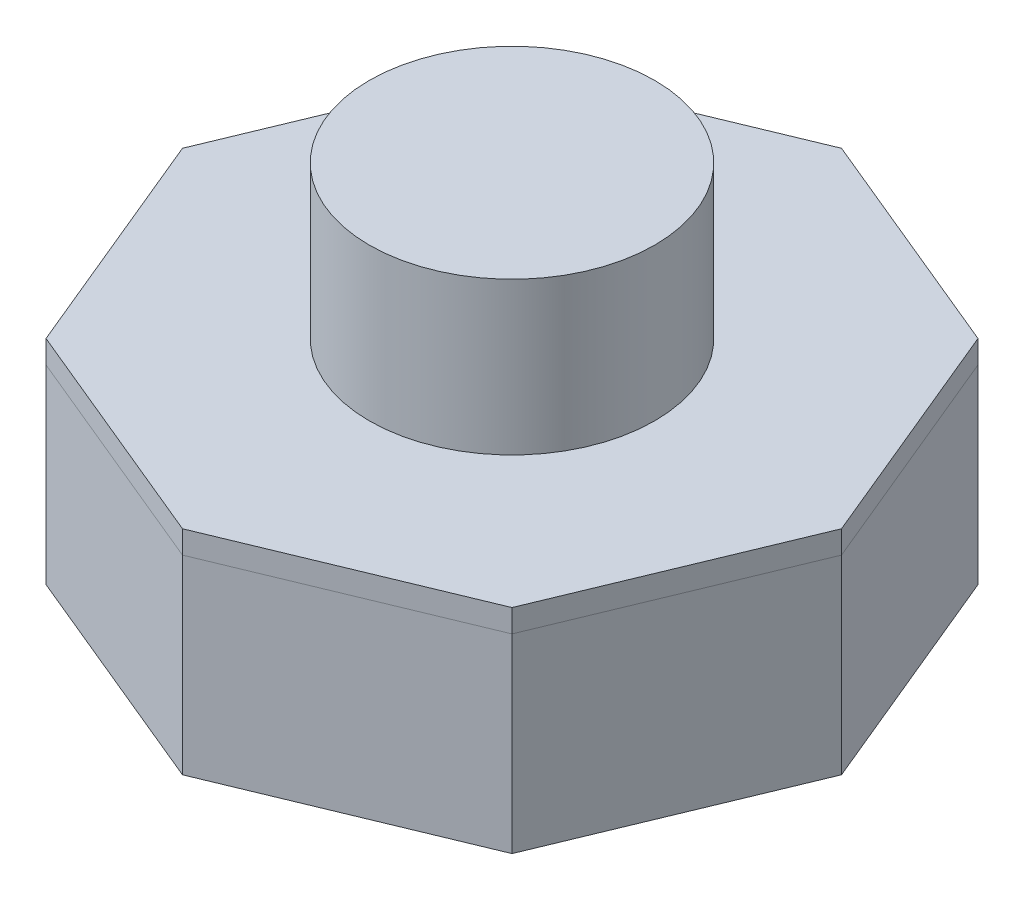
ISO-10303-21;
HEADER;
FILE_DESCRIPTION(('STEP AP214'),'2;1');
FILE_NAME('part.step','',(''),(''),'','','');
FILE_SCHEMA(('AUTOMOTIVE_DESIGN { 1 0 10303 214 1 1 1 1 }'));
ENDSEC;
DATA;
#1=APPLICATION_CONTEXT('core data for automotive mechanical design processes');
#2=APPLICATION_PROTOCOL_DEFINITION('international standard','automotive_design',2000,#1);
#3=PRODUCT_CONTEXT('',#1,'mechanical');
#4=PRODUCT('Part','Part','',(#3));
#5=PRODUCT_RELATED_PRODUCT_CATEGORY('part','',(#4));
#6=PRODUCT_DEFINITION_FORMATION('','',#4);
#7=PRODUCT_DEFINITION_CONTEXT('part definition',#1,'design');
#8=PRODUCT_DEFINITION('design','',#6,#7);
#9=PRODUCT_DEFINITION_SHAPE('','',#8);
#10=(LENGTH_UNIT() NAMED_UNIT(*) SI_UNIT(.MILLI.,.METRE.));
#11=(NAMED_UNIT(*) PLANE_ANGLE_UNIT() SI_UNIT($,.RADIAN.));
#12=(NAMED_UNIT(*) SI_UNIT($,.STERADIAN.) SOLID_ANGLE_UNIT());
#13=UNCERTAINTY_MEASURE_WITH_UNIT(LENGTH_MEASURE(1.E-05),#10,'distance_accuracy_value','');
#14=(GEOMETRIC_REPRESENTATION_CONTEXT(3) GLOBAL_UNCERTAINTY_ASSIGNED_CONTEXT((#13)) GLOBAL_UNIT_ASSIGNED_CONTEXT((#10,
#11,#12)) REPRESENTATION_CONTEXT('',''));
#15=CARTESIAN_POINT('',(0.,0.,0.));
#16=DIRECTION('',(0.,0.,1.));
#17=DIRECTION('',(1.,0.,0.));
#18=AXIS2_PLACEMENT_3D('',#15,#16,#17);
#19=CARTESIAN_POINT('',(17.3182752046783,-10.,-1.25433475933267E-12));
#20=DIRECTION('',(-0.923879532511314,0.,-0.382683432365023));
#21=DIRECTION('',(-0.382683432365023,0.,0.923879532511315));
#22=AXIS2_PLACEMENT_3D('',#19,#20,#21);
#23=PLANE('',#22);
#24=DIRECTION('',(-0.382683432365023,0.,0.923879532511314));
#25=VECTOR('',#24,1.);
#26=CARTESIAN_POINT('',(17.3182752046783,0.,-1.25433475933267E-12));
#27=LINE('',#26,#25);
#28=CARTESIAN_POINT('',(17.3182752046783,0.,-1.25433475933267E-12));
#29=VERTEX_POINT('',#28);
#30=CARTESIAN_POINT('',(12.2458698356837,0.,12.245869835682));
#31=VERTEX_POINT('',#30);
#32=EDGE_CURVE('E139',#29,#31,#27,.T.);
#33=ORIENTED_EDGE('',*,*,#32,.T.);
#34=DIRECTION('',(0.,1.,0.));
#35=VECTOR('',#34,1.);
#36=CARTESIAN_POINT('',(12.2458698356837,-10.,12.245869835682));
#37=LINE('',#36,#35);
#38=CARTESIAN_POINT('',(12.2458698356837,-10.,12.245869835682));
#39=VERTEX_POINT('',#38);
#40=EDGE_CURVE('E12',#39,#31,#37,.T.);
#41=ORIENTED_EDGE('',*,*,#40,.F.);
#42=DIRECTION('',(-0.382683432365023,0.,0.923879532511314));
#43=VECTOR('',#42,1.);
#44=CARTESIAN_POINT('',(17.3182752046783,-10.,-1.25433475933267E-12));
#45=LINE('',#44,#43);
#46=CARTESIAN_POINT('',(17.3182752046783,-10.,-1.25433475933267E-12));
#47=VERTEX_POINT('',#46);
#48=EDGE_CURVE('E153',#47,#39,#45,.T.);
#49=ORIENTED_EDGE('',*,*,#48,.F.);
#50=DIRECTION('',(0.,1.,0.));
#51=VECTOR('',#50,1.);
#52=CARTESIAN_POINT('',(17.3182752046783,-10.,-1.25433475933267E-12));
#53=LINE('',#52,#51);
#54=EDGE_CURVE('E135',#47,#29,#53,.T.);
#55=ORIENTED_EDGE('',*,*,#54,.T.);
#56=EDGE_LOOP('',(#33,#41,#49,#55));
#57=FACE_BOUND('',#56,.T.);
#58=ADVANCED_FACE('F43',(#57),#23,.F.);
#59=CARTESIAN_POINT('',(12.2458698356837,-10.,12.245869835682));
#60=DIRECTION('',(-0.382683432365156,0.,-0.923879532511259));
#61=DIRECTION('',(-0.923879532511259,0.,0.382683432365156));
#62=AXIS2_PLACEMENT_3D('',#59,#60,#61);
#63=PLANE('',#62);
#64=DIRECTION('',(-0.923879532511259,0.,0.382683432365156));
#65=VECTOR('',#64,1.);
#66=CARTESIAN_POINT('',(12.2458698356837,0.,12.245869835682));
#67=LINE('',#66,#65);
#68=CARTESIAN_POINT('',(1.24662596782279E-12,0.,17.3182752046783));
#69=VERTEX_POINT('',#68);
#70=EDGE_CURVE('E142',#31,#69,#67,.T.);
#71=ORIENTED_EDGE('',*,*,#70,.T.);
#72=DIRECTION('',(0.,1.,0.));
#73=VECTOR('',#72,1.);
#74=CARTESIAN_POINT('',(1.24662596782279E-12,-10.,17.3182752046783));
#75=LINE('',#74,#73);
#76=CARTESIAN_POINT('',(1.24662596782279E-12,-10.,17.3182752046783));
#77=VERTEX_POINT('',#76);
#78=EDGE_CURVE('E51',#77,#69,#75,.T.);
#79=ORIENTED_EDGE('',*,*,#78,.F.);
#80=DIRECTION('',(-0.923879532511259,0.,0.382683432365156));
#81=VECTOR('',#80,1.);
#82=CARTESIAN_POINT('',(12.2458698356837,-10.,12.245869835682));
#83=LINE('',#82,#81);
#84=EDGE_CURVE('E102',#39,#77,#83,.T.);
#85=ORIENTED_EDGE('',*,*,#84,.F.);
#86=ORIENTED_EDGE('',*,*,#40,.T.);
#87=EDGE_LOOP('',(#71,#79,#85,#86));
#88=FACE_BOUND('',#87,.T.);
#89=ADVANCED_FACE('F188',(#88),#63,.F.);
#90=CARTESIAN_POINT('',(1.24662596782279E-12,-10.,17.3182752046783));
#91=DIRECTION('',(0.382683432365023,0.,-0.923879532511314));
#92=DIRECTION('',(-0.923879532511314,0.,-0.382683432365023));
#93=AXIS2_PLACEMENT_3D('',#90,#91,#92);
#94=PLANE('',#93);
#95=DIRECTION('',(-0.923879532511314,0.,-0.382683432365023));
#96=VECTOR('',#95,1.);
#97=CARTESIAN_POINT('',(1.24662596782279E-12,0.,17.3182752046783));
#98=LINE('',#97,#96);
#99=CARTESIAN_POINT('',(-12.245869835682,0.,12.2458698356837));
#100=VERTEX_POINT('',#99);
#101=EDGE_CURVE('E144',#69,#100,#98,.T.);
#102=ORIENTED_EDGE('',*,*,#101,.T.);
#103=DIRECTION('',(0.,1.,0.));
#104=VECTOR('',#103,1.);
#105=CARTESIAN_POINT('',(-12.245869835682,-10.,12.2458698356837));
#106=LINE('',#105,#104);
#107=CARTESIAN_POINT('',(-12.245869835682,-10.,12.2458698356837));
#108=VERTEX_POINT('',#107);
#109=EDGE_CURVE('E160',#108,#100,#106,.T.);
#110=ORIENTED_EDGE('',*,*,#109,.F.);
#111=DIRECTION('',(-0.923879532511314,0.,-0.382683432365023));
#112=VECTOR('',#111,1.);
#113=CARTESIAN_POINT('',(1.24662596782279E-12,-10.,17.3182752046783));
#114=LINE('',#113,#112);
#115=EDGE_CURVE('E168',#77,#108,#114,.T.);
#116=ORIENTED_EDGE('',*,*,#115,.F.);
#117=ORIENTED_EDGE('',*,*,#78,.T.);
#118=EDGE_LOOP('',(#102,#110,#116,#117));
#119=FACE_BOUND('',#118,.T.);
#120=ADVANCED_FACE('F166',(#119),#94,.F.);
#121=CARTESIAN_POINT('',(-12.245869835682,-10.,12.2458698356837));
#122=DIRECTION('',(0.923879532511259,0.,-0.382683432365157));
#123=DIRECTION('',(-0.382683432365157,0.,-0.923879532511259));
#124=AXIS2_PLACEMENT_3D('',#121,#122,#123);
#125=PLANE('',#124);
#126=DIRECTION('',(-0.382683432365157,0.,-0.923879532511259));
#127=VECTOR('',#126,1.);
#128=CARTESIAN_POINT('',(-12.245869835682,0.,12.2458698356837));
#129=LINE('',#128,#127);
#130=CARTESIAN_POINT('',(-17.3182752046783,0.,1.25073562617928E-12));
#131=VERTEX_POINT('',#130);
#132=EDGE_CURVE('E146',#100,#131,#129,.T.);
#133=ORIENTED_EDGE('',*,*,#132,.T.);
#134=DIRECTION('',(0.,1.,0.));
#135=VECTOR('',#134,1.);
#136=CARTESIAN_POINT('',(-17.3182752046783,-10.,1.25073562617928E-12));
#137=LINE('',#136,#135);
#138=CARTESIAN_POINT('',(-17.3182752046783,-10.,1.25073562617928E-12));
#139=VERTEX_POINT('',#138);
#140=EDGE_CURVE('E157',#139,#131,#137,.T.);
#141=ORIENTED_EDGE('',*,*,#140,.F.);
#142=DIRECTION('',(-0.382683432365157,0.,-0.923879532511259));
#143=VECTOR('',#142,1.);
#144=CARTESIAN_POINT('',(-12.245869835682,-10.,12.2458698356837));
#145=LINE('',#144,#143);
#146=EDGE_CURVE('E180',#108,#139,#145,.T.);
#147=ORIENTED_EDGE('',*,*,#146,.F.);
#148=ORIENTED_EDGE('',*,*,#109,.T.);
#149=EDGE_LOOP('',(#133,#141,#147,#148));
#150=FACE_BOUND('',#149,.T.);
#151=ADVANCED_FACE('F176',(#150),#125,.F.);
#152=CARTESIAN_POINT('',(-17.3182752046783,-10.,1.25073562617928E-12));
#153=DIRECTION('',(0.923879532511314,0.,0.382683432365023));
#154=DIRECTION('',(0.382683432365023,0.,-0.923879532511314));
#155=AXIS2_PLACEMENT_3D('',#152,#153,#154);
#156=PLANE('',#155);
#157=DIRECTION('',(0.382683432365023,0.,-0.923879532511314));
#158=VECTOR('',#157,1.);
#159=CARTESIAN_POINT('',(-17.3182752046783,0.,1.25073562617928E-12));
#160=LINE('',#159,#158);
#161=CARTESIAN_POINT('',(-12.2458698356837,0.,-12.245869835682));
#162=VERTEX_POINT('',#161);
#163=EDGE_CURVE('E148',#131,#162,#160,.T.);
#164=ORIENTED_EDGE('',*,*,#163,.T.);
#165=DIRECTION('',(0.,1.,0.));
#166=VECTOR('',#165,1.);
#167=CARTESIAN_POINT('',(-12.2458698356837,-10.,-12.245869835682));
#168=LINE('',#167,#166);
#169=CARTESIAN_POINT('',(-12.2458698356837,-10.,-12.245869835682));
#170=VERTEX_POINT('',#169);
#171=EDGE_CURVE('E130',#170,#162,#168,.T.);
#172=ORIENTED_EDGE('',*,*,#171,.F.);
#173=DIRECTION('',(0.382683432365023,0.,-0.923879532511314));
#174=VECTOR('',#173,1.);
#175=CARTESIAN_POINT('',(-17.3182752046783,-10.,1.25073562617928E-12));
#176=LINE('',#175,#174);
#177=EDGE_CURVE('E121',#139,#170,#176,.T.);
#178=ORIENTED_EDGE('',*,*,#177,.F.);
#179=ORIENTED_EDGE('',*,*,#140,.T.);
#180=EDGE_LOOP('',(#164,#172,#178,#179));
#181=FACE_BOUND('',#180,.T.);
#182=ADVANCED_FACE('F179',(#181),#156,.F.);
#183=CARTESIAN_POINT('',(-12.2458698356837,-10.,-12.245869835682));
#184=DIRECTION('',(0.382683432365156,0.,0.923879532511259));
#185=DIRECTION('',(0.923879532511259,0.,-0.382683432365156));
#186=AXIS2_PLACEMENT_3D('',#183,#184,#185);
#187=PLANE('',#186);
#188=DIRECTION('',(0.923879532511259,0.,-0.382683432365157));
#189=VECTOR('',#188,1.);
#190=CARTESIAN_POINT('',(-12.2458698356837,0.,-12.245869835682));
#191=LINE('',#190,#189);
#192=CARTESIAN_POINT('',(-1.25092236488736E-12,0.,-17.3182752046783));
#193=VERTEX_POINT('',#192);
#194=EDGE_CURVE('E129',#162,#193,#191,.T.);
#195=ORIENTED_EDGE('',*,*,#194,.T.);
#196=DIRECTION('',(0.,1.,0.));
#197=VECTOR('',#196,1.);
#198=CARTESIAN_POINT('',(-1.25092236488736E-12,-10.,-17.3182752046783));
#199=LINE('',#198,#197);
#200=CARTESIAN_POINT('',(-1.25092236488736E-12,-10.,-17.3182752046783));
#201=VERTEX_POINT('',#200);
#202=EDGE_CURVE('E126',#201,#193,#199,.T.);
#203=ORIENTED_EDGE('',*,*,#202,.F.);
#204=DIRECTION('',(0.923879532511259,0.,-0.382683432365157));
#205=VECTOR('',#204,1.);
#206=CARTESIAN_POINT('',(-12.2458698356837,-10.,-12.245869835682));
#207=LINE('',#206,#205);
#208=EDGE_CURVE('E115',#170,#201,#207,.T.);
#209=ORIENTED_EDGE('',*,*,#208,.F.);
#210=ORIENTED_EDGE('',*,*,#171,.T.);
#211=EDGE_LOOP('',(#195,#203,#209,#210));
#212=FACE_BOUND('',#211,.T.);
#213=ADVANCED_FACE('F127',(#212),#187,.F.);
#214=CARTESIAN_POINT('',(-1.25092236488736E-12,-10.,-17.3182752046783));
#215=DIRECTION('',(-0.382683432365023,0.,0.923879532511314));
#216=DIRECTION('',(0.923879532511314,0.,0.382683432365023));
#217=AXIS2_PLACEMENT_3D('',#214,#215,#216);
#218=PLANE('',#217);
#219=DIRECTION('',(0.923879532511314,0.,0.382683432365023));
#220=VECTOR('',#219,1.);
#221=CARTESIAN_POINT('',(-1.25092236488736E-12,0.,-17.3182752046783));
#222=LINE('',#221,#220);
#223=CARTESIAN_POINT('',(12.245869835682,0.,-12.2458698356837));
#224=VERTEX_POINT('',#223);
#225=EDGE_CURVE('E88',#193,#224,#222,.T.);
#226=ORIENTED_EDGE('',*,*,#225,.T.);
#227=DIRECTION('',(0.,1.,0.));
#228=VECTOR('',#227,1.);
#229=CARTESIAN_POINT('',(12.245869835682,-10.,-12.2458698356837));
#230=LINE('',#229,#228);
#231=CARTESIAN_POINT('',(12.245869835682,-10.,-12.2458698356837));
#232=VERTEX_POINT('',#231);
#233=EDGE_CURVE('E131',#232,#224,#230,.T.);
#234=ORIENTED_EDGE('',*,*,#233,.F.);
#235=DIRECTION('',(0.923879532511314,0.,0.382683432365023));
#236=VECTOR('',#235,1.);
#237=CARTESIAN_POINT('',(-1.25092236488736E-12,-10.,-17.3182752046783));
#238=LINE('',#237,#236);
#239=EDGE_CURVE('E119',#201,#232,#238,.T.);
#240=ORIENTED_EDGE('',*,*,#239,.F.);
#241=ORIENTED_EDGE('',*,*,#202,.T.);
#242=EDGE_LOOP('',(#226,#234,#240,#241));
#243=FACE_BOUND('',#242,.T.);
#244=ADVANCED_FACE('F133',(#243),#218,.F.);
#245=CARTESIAN_POINT('',(12.245869835682,-10.,-12.2458698356837));
#246=DIRECTION('',(-0.923879532511259,0.,0.382683432365157));
#247=DIRECTION('',(0.382683432365157,0.,0.923879532511259));
#248=AXIS2_PLACEMENT_3D('',#245,#246,#247);
#249=PLANE('',#248);
#250=DIRECTION('',(0.382683432365157,0.,0.923879532511259));
#251=VECTOR('',#250,1.);
#252=CARTESIAN_POINT('',(12.245869835682,0.,-12.2458698356837));
#253=LINE('',#252,#251);
#254=EDGE_CURVE('E94',#224,#29,#253,.T.);
#255=ORIENTED_EDGE('',*,*,#254,.T.);
#256=ORIENTED_EDGE('',*,*,#54,.F.);
#257=DIRECTION('',(0.382683432365157,0.,0.923879532511259));
#258=VECTOR('',#257,1.);
#259=CARTESIAN_POINT('',(12.245869835682,-10.,-12.2458698356837));
#260=LINE('',#259,#258);
#261=EDGE_CURVE('E59',#232,#47,#260,.T.);
#262=ORIENTED_EDGE('',*,*,#261,.F.);
#263=ORIENTED_EDGE('',*,*,#233,.T.);
#264=EDGE_LOOP('',(#255,#256,#262,#263));
#265=FACE_BOUND('',#264,.T.);
#266=ADVANCED_FACE('F204',(#265),#249,.F.);
#267=CARTESIAN_POINT('',(0.,-10.,0.));
#268=DIRECTION('',(0.,-1.,0.));
#269=DIRECTION('',(0.,0.,-1.));
#270=AXIS2_PLACEMENT_3D('',#267,#268,#269);
#271=PLANE('',#270);
#272=ORIENTED_EDGE('',*,*,#48,.T.);
#273=ORIENTED_EDGE('',*,*,#84,.T.);
#274=ORIENTED_EDGE('',*,*,#115,.T.);
#275=ORIENTED_EDGE('',*,*,#146,.T.);
#276=ORIENTED_EDGE('',*,*,#177,.T.);
#277=ORIENTED_EDGE('',*,*,#208,.T.);
#278=ORIENTED_EDGE('',*,*,#239,.T.);
#279=ORIENTED_EDGE('',*,*,#261,.T.);
#280=EDGE_LOOP('',(#272,#273,#274,#275,#276,#277,#278,#279));
#281=FACE_BOUND('',#280,.T.);
#282=ADVANCED_FACE('F117',(#281),#271,.T.);
#283=CARTESIAN_POINT('',(0.,0.,0.));
#284=DIRECTION('',(0.,-1.,0.));
#285=DIRECTION('',(0.,0.,-1.));
#286=AXIS2_PLACEMENT_3D('',#283,#284,#285);
#287=PLANE('',#286);
#288=ORIENTED_EDGE('',*,*,#32,.F.);
#289=ORIENTED_EDGE('',*,*,#254,.F.);
#290=ORIENTED_EDGE('',*,*,#225,.F.);
#291=ORIENTED_EDGE('',*,*,#194,.F.);
#292=ORIENTED_EDGE('',*,*,#163,.F.);
#293=ORIENTED_EDGE('',*,*,#132,.F.);
#294=ORIENTED_EDGE('',*,*,#101,.F.);
#295=ORIENTED_EDGE('',*,*,#70,.F.);
#296=EDGE_LOOP('',(#288,#289,#290,#291,#292,#293,#294,#295));
#297=FACE_BOUND('',#296,.T.);
#298=ADVANCED_FACE('F172',(#297),#287,.F.);
#299=CLOSED_SHELL('',(#58,#89,#120,#151,#182,#213,#244,#266,#282,#298));
#300=MANIFOLD_SOLID_BREP('B2',#299);
#301=CARTESIAN_POINT('',(0.,1.2,0.));
#302=DIRECTION('',(0.,1.,0.));
#303=DIRECTION('',(0.,0.,1.));
#304=AXIS2_PLACEMENT_3D('',#301,#302,#303);
#305=PLANE('',#304);
#306=DIRECTION('',(0.923879532511317,0.,0.382683432365017));
#307=VECTOR('',#306,1.);
#308=CARTESIAN_POINT('',(-12.2458698356819,1.2,12.2458698356838));
#309=LINE('',#308,#307);
#310=CARTESIAN_POINT('',(-12.2458698356819,1.2,12.2458698356838));
#311=VERTEX_POINT('',#310);
#312=CARTESIAN_POINT('',(1.35481903473789E-12,1.2,17.3182752046783));
#313=VERTEX_POINT('',#312);
#314=EDGE_CURVE('E383',#311,#313,#309,.T.);
#315=ORIENTED_EDGE('',*,*,#314,.T.);
#316=DIRECTION('',(0.923879532511257,0.,-0.382683432365162));
#317=VECTOR('',#316,1.);
#318=CARTESIAN_POINT('',(1.35481903473789E-12,1.2,17.3182752046783));
#319=LINE('',#318,#317);
#320=CARTESIAN_POINT('',(12.2458698356838,1.2,12.2458698356819));
#321=VERTEX_POINT('',#320);
#322=EDGE_CURVE('E331',#313,#321,#319,.T.);
#323=ORIENTED_EDGE('',*,*,#322,.T.);
#324=DIRECTION('',(0.382683432365017,0.,-0.923879532511317));
#325=VECTOR('',#324,1.);
#326=CARTESIAN_POINT('',(12.2458698356838,1.2,12.2458698356819));
#327=LINE('',#326,#325);
#328=CARTESIAN_POINT('',(17.3182752046783,1.2,-1.36002320516582E-12));
#329=VERTEX_POINT('',#328);
#330=EDGE_CURVE('E398',#321,#329,#327,.T.);
#331=ORIENTED_EDGE('',*,*,#330,.T.);
#332=DIRECTION('',(-0.382683432365163,0.,-0.923879532511257));
#333=VECTOR('',#332,1.);
#334=CARTESIAN_POINT('',(17.3182752046783,1.2,-1.36002320516582E-12));
#335=LINE('',#334,#333);
#336=CARTESIAN_POINT('',(12.2458698356819,1.2,-12.2458698356838));
#337=VERTEX_POINT('',#336);
#338=EDGE_CURVE('E410',#329,#337,#335,.T.);
#339=ORIENTED_EDGE('',*,*,#338,.T.);
#340=DIRECTION('',(-0.923879532511317,0.,-0.382683432365017));
#341=VECTOR('',#340,1.);
#342=CARTESIAN_POINT('',(12.2458698356819,1.2,-12.2458698356838));
#343=LINE('',#342,#341);
#344=CARTESIAN_POINT('',(-1.36002320516582E-12,1.2,-17.3182752046783));
#345=VERTEX_POINT('',#344);
#346=EDGE_CURVE('E350',#337,#345,#343,.T.);
#347=ORIENTED_EDGE('',*,*,#346,.T.);
#348=DIRECTION('',(-0.923879532511257,0.,0.382683432365163));
#349=VECTOR('',#348,1.);
#350=CARTESIAN_POINT('',(-1.36002320516582E-12,1.2,-17.3182752046783));
#351=LINE('',#350,#349);
#352=CARTESIAN_POINT('',(-12.2458698356838,1.2,-12.2458698356819));
#353=VERTEX_POINT('',#352);
#354=EDGE_CURVE('E344',#345,#353,#351,.T.);
#355=ORIENTED_EDGE('',*,*,#354,.T.);
#356=DIRECTION('',(-0.382683432365017,0.,0.923879532511317));
#357=VECTOR('',#356,1.);
#358=CARTESIAN_POINT('',(-12.2458698356838,1.2,-12.2458698356819));
#359=LINE('',#358,#357);
#360=CARTESIAN_POINT('',(-17.3182752046783,1.2,1.35481903473789E-12));
#361=VERTEX_POINT('',#360);
#362=EDGE_CURVE('E348',#353,#361,#359,.T.);
#363=ORIENTED_EDGE('',*,*,#362,.T.);
#364=DIRECTION('',(0.382683432365162,0.,0.923879532511257));
#365=VECTOR('',#364,1.);
#366=CARTESIAN_POINT('',(-17.3182752046783,1.2,1.35481903473789E-12));
#367=LINE('',#366,#365);
#368=EDGE_CURVE('E288',#361,#311,#367,.T.);
#369=ORIENTED_EDGE('',*,*,#368,.T.);
#370=EDGE_LOOP('',(#315,#323,#331,#339,#347,#355,#363,#369));
#371=FACE_BOUND('',#370,.T.);
#372=CARTESIAN_POINT('',(0.,1.2,0.));
#373=DIRECTION('',(0.,1.,0.));
#374=DIRECTION('',(0.,0.,1.));
#375=AXIS2_PLACEMENT_3D('',#372,#373,#374);
#376=CIRCLE('',#375,7.5);
#377=CARTESIAN_POINT('',(0.,1.2,7.5));
#378=VERTEX_POINT('',#377);
#379=EDGE_CURVE('E416',#378,#378,#376,.T.);
#380=ORIENTED_EDGE('',*,*,#379,.F.);
#381=EDGE_LOOP('',(#380));
#382=FACE_BOUND('',#381,.T.);
#383=ADVANCED_FACE('F271',(#371,#382),#305,.T.);
#384=CARTESIAN_POINT('',(-12.2458698356819,1.2,12.2458698356838));
#385=DIRECTION('',(0.382683432365017,0.,-0.923879532511317));
#386=DIRECTION('',(-0.923879532511317,0.,-0.382683432365017));
#387=AXIS2_PLACEMENT_3D('',#384,#385,#386);
#388=PLANE('',#387);
#389=DIRECTION('',(0.923879532511317,0.,0.382683432365017));
#390=VECTOR('',#389,1.);
#391=CARTESIAN_POINT('',(-12.2458698356819,0.,12.2458698356838));
#392=LINE('',#391,#390);
#393=CARTESIAN_POINT('',(-12.2458698356819,0.,12.2458698356838));
#394=VERTEX_POINT('',#393);
#395=CARTESIAN_POINT('',(1.35481903473789E-12,0.,17.3182752046783));
#396=VERTEX_POINT('',#395);
#397=EDGE_CURVE('E368',#394,#396,#392,.T.);
#398=ORIENTED_EDGE('',*,*,#397,.T.);
#399=DIRECTION('',(0.,-1.,0.));
#400=VECTOR('',#399,1.);
#401=CARTESIAN_POINT('',(1.35481903473789E-12,1.2,17.3182752046783));
#402=LINE('',#401,#400);
#403=EDGE_CURVE('E41',#313,#396,#402,.T.);
#404=ORIENTED_EDGE('',*,*,#403,.F.);
#405=ORIENTED_EDGE('',*,*,#314,.F.);
#406=DIRECTION('',(0.,-1.,0.));
#407=VECTOR('',#406,1.);
#408=CARTESIAN_POINT('',(-12.2458698356819,1.2,12.2458698356838));
#409=LINE('',#408,#407);
#410=EDGE_CURVE('E364',#311,#394,#409,.T.);
#411=ORIENTED_EDGE('',*,*,#410,.T.);
#412=EDGE_LOOP('',(#398,#404,#405,#411));
#413=FACE_BOUND('',#412,.T.);
#414=ADVANCED_FACE('F273',(#413),#388,.F.);
#415=CARTESIAN_POINT('',(1.35481903473789E-12,1.2,17.3182752046783));
#416=DIRECTION('',(-0.382683432365162,0.,-0.923879532511257));
#417=DIRECTION('',(-0.923879532511257,0.,0.382683432365162));
#418=AXIS2_PLACEMENT_3D('',#415,#416,#417);
#419=PLANE('',#418);
#420=DIRECTION('',(0.923879532511257,0.,-0.382683432365162));
#421=VECTOR('',#420,1.);
#422=CARTESIAN_POINT('',(1.35481903473789E-12,0.,17.3182752046783));
#423=LINE('',#422,#421);
#424=CARTESIAN_POINT('',(12.2458698356838,0.,12.2458698356819));
#425=VERTEX_POINT('',#424);
#426=EDGE_CURVE('E371',#396,#425,#423,.T.);
#427=ORIENTED_EDGE('',*,*,#426,.T.);
#428=DIRECTION('',(0.,-1.,0.));
#429=VECTOR('',#428,1.);
#430=CARTESIAN_POINT('',(12.2458698356838,1.2,12.2458698356819));
#431=LINE('',#430,#429);
#432=EDGE_CURVE('E280',#321,#425,#431,.T.);
#433=ORIENTED_EDGE('',*,*,#432,.F.);
#434=ORIENTED_EDGE('',*,*,#322,.F.);
#435=ORIENTED_EDGE('',*,*,#403,.T.);
#436=EDGE_LOOP('',(#427,#433,#434,#435));
#437=FACE_BOUND('',#436,.T.);
#438=ADVANCED_FACE('F434',(#437),#419,.F.);
#439=CARTESIAN_POINT('',(12.2458698356838,1.2,12.2458698356819));
#440=DIRECTION('',(-0.923879532511317,0.,-0.382683432365017));
#441=DIRECTION('',(-0.382683432365017,0.,0.923879532511317));
#442=AXIS2_PLACEMENT_3D('',#439,#440,#441);
#443=PLANE('',#442);
#444=DIRECTION('',(0.382683432365017,0.,-0.923879532511317));
#445=VECTOR('',#444,1.);
#446=CARTESIAN_POINT('',(12.2458698356838,0.,12.2458698356819));
#447=LINE('',#446,#445);
#448=CARTESIAN_POINT('',(17.3182752046783,0.,-1.36002320516582E-12));
#449=VERTEX_POINT('',#448);
#450=EDGE_CURVE('E374',#425,#449,#447,.T.);
#451=ORIENTED_EDGE('',*,*,#450,.T.);
#452=DIRECTION('',(0.,-1.,0.));
#453=VECTOR('',#452,1.);
#454=CARTESIAN_POINT('',(17.3182752046783,1.2,-1.36002320516582E-12));
#455=LINE('',#454,#453);
#456=EDGE_CURVE('E390',#329,#449,#455,.T.);
#457=ORIENTED_EDGE('',*,*,#456,.F.);
#458=ORIENTED_EDGE('',*,*,#330,.F.);
#459=ORIENTED_EDGE('',*,*,#432,.T.);
#460=EDGE_LOOP('',(#451,#457,#458,#459));
#461=FACE_BOUND('',#460,.T.);
#462=ADVANCED_FACE('F396',(#461),#443,.F.);
#463=CARTESIAN_POINT('',(17.3182752046783,1.2,-1.36002320516582E-12));
#464=DIRECTION('',(-0.923879532511256,0.,0.382683432365163));
#465=DIRECTION('',(0.382683432365163,0.,0.923879532511257));
#466=AXIS2_PLACEMENT_3D('',#463,#464,#465);
#467=PLANE('',#466);
#468=DIRECTION('',(-0.382683432365163,0.,-0.923879532511257));
#469=VECTOR('',#468,1.);
#470=CARTESIAN_POINT('',(17.3182752046783,0.,-1.36002320516582E-12));
#471=LINE('',#470,#469);
#472=CARTESIAN_POINT('',(12.2458698356819,0.,-12.2458698356838));
#473=VERTEX_POINT('',#472);
#474=EDGE_CURVE('E376',#449,#473,#471,.T.);
#475=ORIENTED_EDGE('',*,*,#474,.T.);
#476=DIRECTION('',(0.,-1.,0.));
#477=VECTOR('',#476,1.);
#478=CARTESIAN_POINT('',(12.2458698356819,1.2,-12.2458698356838));
#479=LINE('',#478,#477);
#480=EDGE_CURVE('E387',#337,#473,#479,.T.);
#481=ORIENTED_EDGE('',*,*,#480,.F.);
#482=ORIENTED_EDGE('',*,*,#338,.F.);
#483=ORIENTED_EDGE('',*,*,#456,.T.);
#484=EDGE_LOOP('',(#475,#481,#482,#483));
#485=FACE_BOUND('',#484,.T.);
#486=ADVANCED_FACE('F406',(#485),#467,.F.);
#487=CARTESIAN_POINT('',(12.2458698356819,1.2,-12.2458698356838));
#488=DIRECTION('',(-0.382683432365017,0.,0.923879532511317));
#489=DIRECTION('',(0.923879532511317,0.,0.382683432365017));
#490=AXIS2_PLACEMENT_3D('',#487,#488,#489);
#491=PLANE('',#490);
#492=DIRECTION('',(-0.923879532511317,0.,-0.382683432365017));
#493=VECTOR('',#492,1.);
#494=CARTESIAN_POINT('',(12.2458698356819,0.,-12.2458698356838));
#495=LINE('',#494,#493);
#496=CARTESIAN_POINT('',(-1.36002320516582E-12,0.,-17.3182752046783));
#497=VERTEX_POINT('',#496);
#498=EDGE_CURVE('E378',#473,#497,#495,.T.);
#499=ORIENTED_EDGE('',*,*,#498,.T.);
#500=DIRECTION('',(0.,-1.,0.));
#501=VECTOR('',#500,1.);
#502=CARTESIAN_POINT('',(-1.36002320516582E-12,1.2,-17.3182752046783));
#503=LINE('',#502,#501);
#504=EDGE_CURVE('E359',#345,#497,#503,.T.);
#505=ORIENTED_EDGE('',*,*,#504,.F.);
#506=ORIENTED_EDGE('',*,*,#346,.F.);
#507=ORIENTED_EDGE('',*,*,#480,.T.);
#508=EDGE_LOOP('',(#499,#505,#506,#507));
#509=FACE_BOUND('',#508,.T.);
#510=ADVANCED_FACE('F409',(#509),#491,.F.);
#511=CARTESIAN_POINT('',(-1.36002320516582E-12,1.2,-17.3182752046783));
#512=DIRECTION('',(0.382683432365163,0.,0.923879532511256));
#513=DIRECTION('',(0.923879532511257,0.,-0.382683432365163));
#514=AXIS2_PLACEMENT_3D('',#511,#512,#513);
#515=PLANE('',#514);
#516=DIRECTION('',(-0.923879532511257,0.,0.382683432365163));
#517=VECTOR('',#516,1.);
#518=CARTESIAN_POINT('',(-1.36002320516582E-12,0.,-17.3182752046783));
#519=LINE('',#518,#517);
#520=CARTESIAN_POINT('',(-12.2458698356838,0.,-12.2458698356819));
#521=VERTEX_POINT('',#520);
#522=EDGE_CURVE('E358',#497,#521,#519,.T.);
#523=ORIENTED_EDGE('',*,*,#522,.T.);
#524=DIRECTION('',(0.,-1.,0.));
#525=VECTOR('',#524,1.);
#526=CARTESIAN_POINT('',(-12.2458698356838,1.2,-12.2458698356819));
#527=LINE('',#526,#525);
#528=EDGE_CURVE('E355',#353,#521,#527,.T.);
#529=ORIENTED_EDGE('',*,*,#528,.F.);
#530=ORIENTED_EDGE('',*,*,#354,.F.);
#531=ORIENTED_EDGE('',*,*,#504,.T.);
#532=EDGE_LOOP('',(#523,#529,#530,#531));
#533=FACE_BOUND('',#532,.T.);
#534=ADVANCED_FACE('F356',(#533),#515,.F.);
#535=CARTESIAN_POINT('',(-12.2458698356838,1.2,-12.2458698356819));
#536=DIRECTION('',(0.923879532511317,0.,0.382683432365017));
#537=DIRECTION('',(0.382683432365018,0.,-0.923879532511317));
#538=AXIS2_PLACEMENT_3D('',#535,#536,#537);
#539=PLANE('',#538);
#540=DIRECTION('',(-0.382683432365017,0.,0.923879532511317));
#541=VECTOR('',#540,1.);
#542=CARTESIAN_POINT('',(-12.2458698356838,0.,-12.2458698356819));
#543=LINE('',#542,#541);
#544=CARTESIAN_POINT('',(-17.3182752046783,0.,1.35481903473789E-12));
#545=VERTEX_POINT('',#544);
#546=EDGE_CURVE('E317',#521,#545,#543,.T.);
#547=ORIENTED_EDGE('',*,*,#546,.T.);
#548=DIRECTION('',(0.,-1.,0.));
#549=VECTOR('',#548,1.);
#550=CARTESIAN_POINT('',(-17.3182752046783,1.2,1.35481903473789E-12));
#551=LINE('',#550,#549);
#552=EDGE_CURVE('E360',#361,#545,#551,.T.);
#553=ORIENTED_EDGE('',*,*,#552,.F.);
#554=ORIENTED_EDGE('',*,*,#362,.F.);
#555=ORIENTED_EDGE('',*,*,#528,.T.);
#556=EDGE_LOOP('',(#547,#553,#554,#555));
#557=FACE_BOUND('',#556,.T.);
#558=ADVANCED_FACE('F362',(#557),#539,.F.);
#559=CARTESIAN_POINT('',(-17.3182752046783,1.2,1.35481903473789E-12));
#560=DIRECTION('',(0.923879532511257,0.,-0.382683432365162));
#561=DIRECTION('',(-0.382683432365162,0.,-0.923879532511257));
#562=AXIS2_PLACEMENT_3D('',#559,#560,#561);
#563=PLANE('',#562);
#564=DIRECTION('',(0.382683432365162,0.,0.923879532511257));
#565=VECTOR('',#564,1.);
#566=CARTESIAN_POINT('',(-17.3182752046783,0.,1.35481903473789E-12));
#567=LINE('',#566,#565);
#568=EDGE_CURVE('E323',#545,#394,#567,.T.);
#569=ORIENTED_EDGE('',*,*,#568,.T.);
#570=ORIENTED_EDGE('',*,*,#410,.F.);
#571=ORIENTED_EDGE('',*,*,#368,.F.);
#572=ORIENTED_EDGE('',*,*,#552,.T.);
#573=EDGE_LOOP('',(#569,#570,#571,#572));
#574=FACE_BOUND('',#573,.T.);
#575=ADVANCED_FACE('F440',(#574),#563,.F.);
#576=CARTESIAN_POINT('',(0.,0.,0.));
#577=DIRECTION('',(0.,1.,0.));
#578=DIRECTION('',(0.,0.,1.));
#579=AXIS2_PLACEMENT_3D('',#576,#577,#578);
#580=PLANE('',#579);
#581=ORIENTED_EDGE('',*,*,#397,.F.);
#582=ORIENTED_EDGE('',*,*,#568,.F.);
#583=ORIENTED_EDGE('',*,*,#546,.F.);
#584=ORIENTED_EDGE('',*,*,#522,.F.);
#585=ORIENTED_EDGE('',*,*,#498,.F.);
#586=ORIENTED_EDGE('',*,*,#474,.F.);
#587=ORIENTED_EDGE('',*,*,#450,.F.);
#588=ORIENTED_EDGE('',*,*,#426,.F.);
#589=EDGE_LOOP('',(#581,#582,#583,#584,#585,#586,#587,#588));
#590=FACE_BOUND('',#589,.T.);
#591=ADVANCED_FACE('F402',(#590),#580,.F.);
#592=CARTESIAN_POINT('',(0.,9.2,0.));
#593=DIRECTION('',(0.,-1.,0.));
#594=DIRECTION('',(0.,0.,-1.));
#595=AXIS2_PLACEMENT_3D('',#592,#593,#594);
#596=CYLINDRICAL_SURFACE('',#595,7.5);
#597=CARTESIAN_POINT('',(0.,9.2,0.));
#598=DIRECTION('',(0.,1.,0.));
#599=DIRECTION('',(0.,0.,1.));
#600=AXIS2_PLACEMENT_3D('',#597,#598,#599);
#601=CIRCLE('',#600,7.5);
#602=CARTESIAN_POINT('',(0.,9.2,7.5));
#603=VERTEX_POINT('',#602);
#604=EDGE_CURVE('E372',#603,#603,#601,.T.);
#605=ORIENTED_EDGE('',*,*,#604,.F.);
#606=EDGE_LOOP('',(#605));
#607=FACE_BOUND('',#606,.T.);
#608=ORIENTED_EDGE('',*,*,#379,.T.);
#609=EDGE_LOOP('',(#608));
#610=FACE_BOUND('',#609,.T.);
#611=ADVANCED_FACE('F424',(#607,#610),#596,.T.);
#612=CARTESIAN_POINT('',(0.,9.2,0.));
#613=DIRECTION('',(0.,1.,0.));
#614=DIRECTION('',(0.,0.,1.));
#615=AXIS2_PLACEMENT_3D('',#612,#613,#614);
#616=PLANE('',#615);
#617=ORIENTED_EDGE('',*,*,#604,.T.);
#618=EDGE_LOOP('',(#617));
#619=FACE_BOUND('',#618,.T.);
#620=ADVANCED_FACE('F422',(#619),#616,.T.);
#621=CLOSED_SHELL('',(#383,#414,#438,#462,#486,#510,#534,#558,#575,#591,#611,#620));
#622=MANIFOLD_SOLID_BREP('B6',#621);
#623=ADVANCED_BREP_SHAPE_REPRESENTATION('',(#18,#300,#622),#14);
#624=SHAPE_DEFINITION_REPRESENTATION(#9,#623);
ENDSEC;
END-ISO-10303-21;
